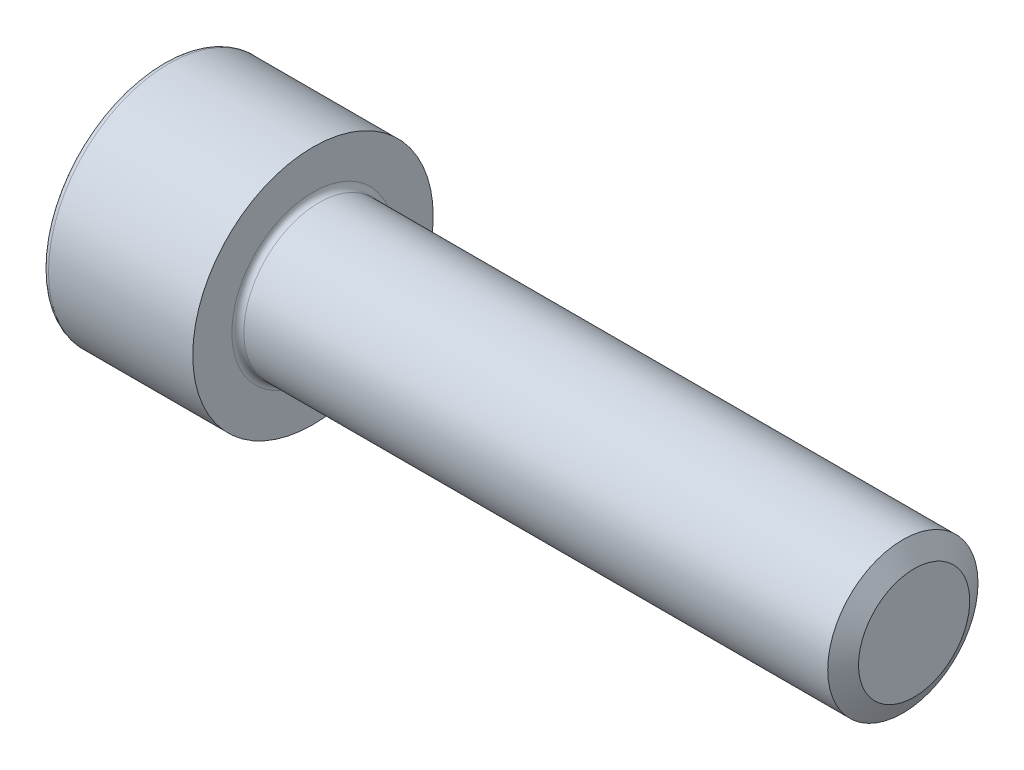
ISO-10303-21;
HEADER;
FILE_DESCRIPTION(('STEP AP214'),'2;1');
FILE_NAME('part.step','',(''),(''),'','','');
FILE_SCHEMA(('AUTOMOTIVE_DESIGN { 1 0 10303 214 1 1 1 1 }'));
ENDSEC;
DATA;
#1=APPLICATION_CONTEXT('core data for automotive mechanical design processes');
#2=APPLICATION_PROTOCOL_DEFINITION('international standard','automotive_design',2000,#1);
#3=PRODUCT_CONTEXT('',#1,'mechanical');
#4=PRODUCT('Part','Part','',(#3));
#5=PRODUCT_RELATED_PRODUCT_CATEGORY('part','',(#4));
#6=PRODUCT_DEFINITION_FORMATION('','',#4);
#7=PRODUCT_DEFINITION_CONTEXT('part definition',#1,'design');
#8=PRODUCT_DEFINITION('design','',#6,#7);
#9=PRODUCT_DEFINITION_SHAPE('','',#8);
#10=(LENGTH_UNIT() NAMED_UNIT(*) SI_UNIT(.MILLI.,.METRE.));
#11=(NAMED_UNIT(*) PLANE_ANGLE_UNIT() SI_UNIT($,.RADIAN.));
#12=(NAMED_UNIT(*) SI_UNIT($,.STERADIAN.) SOLID_ANGLE_UNIT());
#13=UNCERTAINTY_MEASURE_WITH_UNIT(LENGTH_MEASURE(1.E-05),#10,'distance_accuracy_value','');
#14=(GEOMETRIC_REPRESENTATION_CONTEXT(3) GLOBAL_UNCERTAINTY_ASSIGNED_CONTEXT((#13)) GLOBAL_UNIT_ASSIGNED_CONTEXT((#10,
#11,#12)) REPRESENTATION_CONTEXT('',''));
#15=CARTESIAN_POINT('',(0.,0.,0.));
#16=DIRECTION('',(0.,0.,1.));
#17=DIRECTION('',(1.,0.,0.));
#18=AXIS2_PLACEMENT_3D('',#15,#16,#17);
#19=CARTESIAN_POINT('',(0.,0.,0.));
#20=DIRECTION('',(1.,0.,0.));
#21=DIRECTION('',(0.,0.,-1.));
#22=AXIS2_PLACEMENT_3D('',#19,#20,#21);
#23=CYLINDRICAL_SURFACE('',#22,5.);
#24=CARTESIAN_POINT('',(10.4,0.,0.));
#25=DIRECTION('',(1.,0.,0.));
#26=DIRECTION('',(0.,0.,-1.));
#27=AXIS2_PLACEMENT_3D('',#24,#25,#26);
#28=CIRCLE('',#27,5.);
#29=CARTESIAN_POINT('',(10.4,0.,-5.));
#30=VERTEX_POINT('',#29);
#31=EDGE_CURVE('E120',#30,#30,#28,.T.);
#32=ORIENTED_EDGE('',*,*,#31,.T.);
#33=EDGE_LOOP('',(#32));
#34=FACE_BOUND('',#33,.T.);
#35=CARTESIAN_POINT('',(49.25,0.,0.));
#36=DIRECTION('',(-1.,0.,0.));
#37=DIRECTION('',(0.,0.,1.));
#38=AXIS2_PLACEMENT_3D('',#35,#36,#37);
#39=CIRCLE('',#38,5.);
#40=CARTESIAN_POINT('',(49.25,0.,5.));
#41=VERTEX_POINT('',#40);
#42=EDGE_CURVE('E309',#41,#41,#39,.T.);
#43=ORIENTED_EDGE('',*,*,#42,.T.);
#44=EDGE_LOOP('',(#43));
#45=FACE_BOUND('',#44,.T.);
#46=ADVANCED_FACE('F17',(#34,#45),#23,.T.);
#47=CARTESIAN_POINT('',(0.,0.,0.));
#48=DIRECTION('',(-1.,0.,0.));
#49=DIRECTION('',(0.,0.,1.));
#50=AXIS2_PLACEMENT_3D('',#47,#48,#49);
#51=PLANE('',#50);
#52=CARTESIAN_POINT('',(0.,0.,0.));
#53=DIRECTION('',(-1.,0.,0.));
#54=DIRECTION('',(0.,0.,1.));
#55=AXIS2_PLACEMENT_3D('',#52,#53,#54);
#56=CIRCLE('',#55,7.6);
#57=CARTESIAN_POINT('',(0.,0.,7.6));
#58=VERTEX_POINT('',#57);
#59=EDGE_CURVE('E11',#58,#58,#56,.T.);
#60=ORIENTED_EDGE('',*,*,#59,.T.);
#61=EDGE_LOOP('',(#60));
#62=FACE_BOUND('',#61,.T.);
#63=DIRECTION('',(0.,0.5,0.866025403784439));
#64=VECTOR('',#63,1.);
#65=CARTESIAN_POINT('',(0.,-4.575,0.));
#66=LINE('',#65,#64);
#67=CARTESIAN_POINT('',(0.,-4.575,0.));
#68=VERTEX_POINT('',#67);
#69=CARTESIAN_POINT('',(0.,-2.2875,3.96206622231381));
#70=VERTEX_POINT('',#69);
#71=EDGE_CURVE('E32',#68,#70,#66,.T.);
#72=ORIENTED_EDGE('',*,*,#71,.F.);
#73=DIRECTION('',(0.,-0.5,0.866025403784439));
#74=VECTOR('',#73,1.);
#75=CARTESIAN_POINT('',(0.,-2.2875,-3.96206622231381));
#76=LINE('',#75,#74);
#77=CARTESIAN_POINT('',(0.,-2.2875,-3.96206622231381));
#78=VERTEX_POINT('',#77);
#79=EDGE_CURVE('E116',#78,#68,#76,.T.);
#80=ORIENTED_EDGE('',*,*,#79,.F.);
#81=DIRECTION('',(0.,-1.,0.));
#82=VECTOR('',#81,1.);
#83=CARTESIAN_POINT('',(0.,2.2875,-3.96206622231381));
#84=LINE('',#83,#82);
#85=CARTESIAN_POINT('',(0.,2.2875,-3.96206622231381));
#86=VERTEX_POINT('',#85);
#87=EDGE_CURVE('E114',#86,#78,#84,.T.);
#88=ORIENTED_EDGE('',*,*,#87,.F.);
#89=DIRECTION('',(0.,-0.5,-0.866025403784439));
#90=VECTOR('',#89,1.);
#91=CARTESIAN_POINT('',(0.,4.575,0.));
#92=LINE('',#91,#90);
#93=CARTESIAN_POINT('',(0.,4.575,0.));
#94=VERTEX_POINT('',#93);
#95=EDGE_CURVE('E80',#94,#86,#92,.T.);
#96=ORIENTED_EDGE('',*,*,#95,.F.);
#97=DIRECTION('',(0.,0.5,-0.866025403784439));
#98=VECTOR('',#97,1.);
#99=CARTESIAN_POINT('',(0.,2.2875,3.96206622231381));
#100=LINE('',#99,#98);
#101=CARTESIAN_POINT('',(0.,2.2875,3.96206622231381));
#102=VERTEX_POINT('',#101);
#103=EDGE_CURVE('E110',#102,#94,#100,.T.);
#104=ORIENTED_EDGE('',*,*,#103,.F.);
#105=DIRECTION('',(0.,1.,0.));
#106=VECTOR('',#105,1.);
#107=CARTESIAN_POINT('',(0.,-2.2875,3.96206622231381));
#108=LINE('',#107,#106);
#109=EDGE_CURVE('E106',#70,#102,#108,.T.);
#110=ORIENTED_EDGE('',*,*,#109,.F.);
#111=EDGE_LOOP('',(#72,#80,#88,#96,#104,#110));
#112=FACE_BOUND('',#111,.T.);
#113=ADVANCED_FACE('F156',(#62,#112),#51,.T.);
#114=CARTESIAN_POINT('',(0.,0.,0.));
#115=DIRECTION('',(1.,0.,0.));
#116=DIRECTION('',(0.,0.,-1.));
#117=AXIS2_PLACEMENT_3D('',#114,#115,#116);
#118=CYLINDRICAL_SURFACE('',#117,8.);
#119=CARTESIAN_POINT('',(0.4,0.,0.));
#120=DIRECTION('',(-1.,0.,0.));
#121=DIRECTION('',(0.,0.,1.));
#122=AXIS2_PLACEMENT_3D('',#119,#120,#121);
#123=CIRCLE('',#122,8.);
#124=CARTESIAN_POINT('',(0.4,0.,8.));
#125=VERTEX_POINT('',#124);
#126=EDGE_CURVE('E25',#125,#125,#123,.F.);
#127=ORIENTED_EDGE('',*,*,#126,.T.);
#128=EDGE_LOOP('',(#127));
#129=FACE_BOUND('',#128,.T.);
#130=CARTESIAN_POINT('',(10.,0.,0.));
#131=DIRECTION('',(1.,0.,0.));
#132=DIRECTION('',(0.,0.,-1.));
#133=AXIS2_PLACEMENT_3D('',#130,#131,#132);
#134=CIRCLE('',#133,8.);
#135=CARTESIAN_POINT('',(10.,0.,-8.));
#136=VERTEX_POINT('',#135);
#137=EDGE_CURVE('E131',#136,#136,#134,.T.);
#138=ORIENTED_EDGE('',*,*,#137,.F.);
#139=EDGE_LOOP('',(#138));
#140=FACE_BOUND('',#139,.T.);
#141=ADVANCED_FACE('F137',(#129,#140),#118,.T.);
#142=CARTESIAN_POINT('',(10.,8.,0.));
#143=DIRECTION('',(1.,0.,0.));
#144=DIRECTION('',(0.,0.,-1.));
#145=AXIS2_PLACEMENT_3D('',#142,#143,#144);
#146=PLANE('',#145);
#147=ORIENTED_EDGE('',*,*,#137,.T.);
#148=EDGE_LOOP('',(#147));
#149=FACE_BOUND('',#148,.T.);
#150=CARTESIAN_POINT('',(10.,0.,0.));
#151=DIRECTION('',(1.,0.,0.));
#152=DIRECTION('',(0.,0.,-1.));
#153=AXIS2_PLACEMENT_3D('',#150,#151,#152);
#154=CIRCLE('',#153,5.4);
#155=CARTESIAN_POINT('',(10.,0.,-5.4));
#156=VERTEX_POINT('',#155);
#157=EDGE_CURVE('E128',#156,#156,#154,.T.);
#158=ORIENTED_EDGE('',*,*,#157,.F.);
#159=EDGE_LOOP('',(#158));
#160=FACE_BOUND('',#159,.T.);
#161=ADVANCED_FACE('F173',(#149,#160),#146,.T.);
#162=CARTESIAN_POINT('',(10.4,0.,0.));
#163=DIRECTION('',(1.,0.,0.));
#164=DIRECTION('',(0.,0.,-1.));
#165=AXIS2_PLACEMENT_3D('',#162,#163,#164);
#166=TOROIDAL_SURFACE('',#165,5.4,0.4);
#167=ORIENTED_EDGE('',*,*,#157,.T.);
#168=EDGE_LOOP('',(#167));
#169=FACE_BOUND('',#168,.T.);
#170=ORIENTED_EDGE('',*,*,#31,.F.);
#171=EDGE_LOOP('',(#170));
#172=FACE_BOUND('',#171,.T.);
#173=ADVANCED_FACE('F169',(#169,#172),#166,.F.);
#174=CARTESIAN_POINT('',(5.,-4.575,0.));
#175=DIRECTION('',(0.,-0.866025403784439,0.5));
#176=DIRECTION('',(0.,-0.5,-0.866025403784439));
#177=AXIS2_PLACEMENT_3D('',#174,#175,#176);
#178=PLANE('',#177);
#179=ORIENTED_EDGE('',*,*,#71,.T.);
#180=DIRECTION('',(-1.,0.,0.));
#181=VECTOR('',#180,1.);
#182=CARTESIAN_POINT('',(5.,-2.2875,3.96206622231381));
#183=LINE('',#182,#181);
#184=CARTESIAN_POINT('',(5.,-2.2875,3.96206622231381));
#185=VERTEX_POINT('',#184);
#186=EDGE_CURVE('E62',#185,#70,#183,.T.);
#187=ORIENTED_EDGE('',*,*,#186,.F.);
#188=DIRECTION('',(0.,0.5,0.866025403784439));
#189=VECTOR('',#188,1.);
#190=CARTESIAN_POINT('',(5.,-4.575,0.));
#191=LINE('',#190,#189);
#192=CARTESIAN_POINT('',(5.,-4.575,0.));
#193=VERTEX_POINT('',#192);
#194=EDGE_CURVE('E118',#193,#185,#191,.T.);
#195=ORIENTED_EDGE('',*,*,#194,.F.);
#196=DIRECTION('',(-1.,0.,0.));
#197=VECTOR('',#196,1.);
#198=CARTESIAN_POINT('',(5.,-4.575,0.));
#199=LINE('',#198,#197);
#200=EDGE_CURVE('E40',#193,#68,#199,.T.);
#201=ORIENTED_EDGE('',*,*,#200,.T.);
#202=EDGE_LOOP('',(#179,#187,#195,#201));
#203=FACE_BOUND('',#202,.T.);
#204=ADVANCED_FACE('F172',(#203),#178,.F.);
#205=CARTESIAN_POINT('',(5.,-2.2875,-3.96206622231381));
#206=DIRECTION('',(0.,-0.866025403784439,-0.5));
#207=DIRECTION('',(0.,0.5,-0.866025403784439));
#208=AXIS2_PLACEMENT_3D('',#205,#206,#207);
#209=PLANE('',#208);
#210=ORIENTED_EDGE('',*,*,#79,.T.);
#211=ORIENTED_EDGE('',*,*,#200,.F.);
#212=DIRECTION('',(0.,-0.5,0.866025403784439));
#213=VECTOR('',#212,1.);
#214=CARTESIAN_POINT('',(5.,-2.2875,-3.96206622231381));
#215=LINE('',#214,#213);
#216=CARTESIAN_POINT('',(5.,-2.2875,-3.96206622231381));
#217=VERTEX_POINT('',#216);
#218=EDGE_CURVE('E92',#217,#193,#215,.T.);
#219=ORIENTED_EDGE('',*,*,#218,.F.);
#220=DIRECTION('',(-1.,0.,0.));
#221=VECTOR('',#220,1.);
#222=CARTESIAN_POINT('',(5.,-2.2875,-3.96206622231381));
#223=LINE('',#222,#221);
#224=EDGE_CURVE('E84',#217,#78,#223,.T.);
#225=ORIENTED_EDGE('',*,*,#224,.T.);
#226=EDGE_LOOP('',(#210,#211,#219,#225));
#227=FACE_BOUND('',#226,.T.);
#228=ADVANCED_FACE('F205',(#227),#209,.F.);
#229=CARTESIAN_POINT('',(5.,2.2875,-3.96206622231381));
#230=DIRECTION('',(0.,0.,-1.));
#231=DIRECTION('',(0.,1.,0.));
#232=AXIS2_PLACEMENT_3D('',#229,#230,#231);
#233=PLANE('',#232);
#234=ORIENTED_EDGE('',*,*,#87,.T.);
#235=ORIENTED_EDGE('',*,*,#224,.F.);
#236=DIRECTION('',(0.,-1.,0.));
#237=VECTOR('',#236,1.);
#238=CARTESIAN_POINT('',(5.,2.2875,-3.96206622231381));
#239=LINE('',#238,#237);
#240=CARTESIAN_POINT('',(5.,2.2875,-3.96206622231381));
#241=VERTEX_POINT('',#240);
#242=EDGE_CURVE('E88',#241,#217,#239,.T.);
#243=ORIENTED_EDGE('',*,*,#242,.F.);
#244=DIRECTION('',(-1.,0.,0.));
#245=VECTOR('',#244,1.);
#246=CARTESIAN_POINT('',(5.,2.2875,-3.96206622231381));
#247=LINE('',#246,#245);
#248=EDGE_CURVE('E73',#241,#86,#247,.T.);
#249=ORIENTED_EDGE('',*,*,#248,.T.);
#250=EDGE_LOOP('',(#234,#235,#243,#249));
#251=FACE_BOUND('',#250,.T.);
#252=ADVANCED_FACE('F89',(#251),#233,.F.);
#253=CARTESIAN_POINT('',(5.,4.575,0.));
#254=DIRECTION('',(0.,0.866025403784439,-0.5));
#255=DIRECTION('',(0.,0.5,0.866025403784439));
#256=AXIS2_PLACEMENT_3D('',#253,#254,#255);
#257=PLANE('',#256);
#258=ORIENTED_EDGE('',*,*,#95,.T.);
#259=ORIENTED_EDGE('',*,*,#248,.F.);
#260=DIRECTION('',(0.,-0.5,-0.866025403784439));
#261=VECTOR('',#260,1.);
#262=CARTESIAN_POINT('',(5.,4.575,0.));
#263=LINE('',#262,#261);
#264=CARTESIAN_POINT('',(5.,4.575,0.));
#265=VERTEX_POINT('',#264);
#266=EDGE_CURVE('E77',#265,#241,#263,.T.);
#267=ORIENTED_EDGE('',*,*,#266,.F.);
#268=DIRECTION('',(-1.,0.,0.));
#269=VECTOR('',#268,1.);
#270=CARTESIAN_POINT('',(5.,4.575,0.));
#271=LINE('',#270,#269);
#272=EDGE_CURVE('E85',#265,#94,#271,.T.);
#273=ORIENTED_EDGE('',*,*,#272,.T.);
#274=EDGE_LOOP('',(#258,#259,#267,#273));
#275=FACE_BOUND('',#274,.T.);
#276=ADVANCED_FACE('F75',(#275),#257,.F.);
#277=CARTESIAN_POINT('',(5.,2.2875,3.96206622231381));
#278=DIRECTION('',(0.,0.866025403784439,0.5));
#279=DIRECTION('',(0.,-0.5,0.866025403784439));
#280=AXIS2_PLACEMENT_3D('',#277,#278,#279);
#281=PLANE('',#280);
#282=ORIENTED_EDGE('',*,*,#103,.T.);
#283=ORIENTED_EDGE('',*,*,#272,.F.);
#284=DIRECTION('',(0.,0.5,-0.866025403784439));
#285=VECTOR('',#284,1.);
#286=CARTESIAN_POINT('',(5.,2.2875,3.96206622231381));
#287=LINE('',#286,#285);
#288=CARTESIAN_POINT('',(5.,2.2875,3.96206622231381));
#289=VERTEX_POINT('',#288);
#290=EDGE_CURVE('E98',#289,#265,#287,.T.);
#291=ORIENTED_EDGE('',*,*,#290,.F.);
#292=DIRECTION('',(-1.,0.,0.));
#293=VECTOR('',#292,1.);
#294=CARTESIAN_POINT('',(5.,2.2875,3.96206622231381));
#295=LINE('',#294,#293);
#296=EDGE_CURVE('E123',#289,#102,#295,.T.);
#297=ORIENTED_EDGE('',*,*,#296,.T.);
#298=EDGE_LOOP('',(#282,#283,#291,#297));
#299=FACE_BOUND('',#298,.T.);
#300=ADVANCED_FACE('F226',(#299),#281,.F.);
#301=CARTESIAN_POINT('',(5.,-2.2875,3.96206622231381));
#302=DIRECTION('',(0.,0.,1.));
#303=DIRECTION('',(0.,-1.,0.));
#304=AXIS2_PLACEMENT_3D('',#301,#302,#303);
#305=PLANE('',#304);
#306=ORIENTED_EDGE('',*,*,#109,.T.);
#307=ORIENTED_EDGE('',*,*,#296,.F.);
#308=DIRECTION('',(0.,1.,0.));
#309=VECTOR('',#308,1.);
#310=CARTESIAN_POINT('',(5.,-2.2875,3.96206622231381));
#311=LINE('',#310,#309);
#312=EDGE_CURVE('E100',#185,#289,#311,.T.);
#313=ORIENTED_EDGE('',*,*,#312,.F.);
#314=ORIENTED_EDGE('',*,*,#186,.T.);
#315=EDGE_LOOP('',(#306,#307,#313,#314));
#316=FACE_BOUND('',#315,.T.);
#317=ADVANCED_FACE('F152',(#316),#305,.F.);
#318=CARTESIAN_POINT('',(5.,-2.2875,3.96206622231381));
#319=DIRECTION('',(-1.,0.,0.));
#320=DIRECTION('',(0.,0.,1.));
#321=AXIS2_PLACEMENT_3D('',#318,#319,#320);
#322=PLANE('',#321);
#323=ORIENTED_EDGE('',*,*,#194,.T.);
#324=ORIENTED_EDGE('',*,*,#312,.T.);
#325=ORIENTED_EDGE('',*,*,#290,.T.);
#326=ORIENTED_EDGE('',*,*,#266,.T.);
#327=ORIENTED_EDGE('',*,*,#242,.T.);
#328=ORIENTED_EDGE('',*,*,#218,.T.);
#329=EDGE_LOOP('',(#323,#324,#325,#326,#327,#328));
#330=FACE_BOUND('',#329,.T.);
#331=ADVANCED_FACE('F95',(#330),#322,.T.);
#332=CARTESIAN_POINT('',(0.4,0.,0.));
#333=DIRECTION('',(-1.,0.,0.));
#334=DIRECTION('',(0.,0.,1.));
#335=AXIS2_PLACEMENT_3D('',#332,#333,#334);
#336=TOROIDAL_SURFACE('',#335,7.6,0.4);
#337=ORIENTED_EDGE('',*,*,#59,.F.);
#338=EDGE_LOOP('',(#337));
#339=FACE_BOUND('',#338,.T.);
#340=ORIENTED_EDGE('',*,*,#126,.F.);
#341=EDGE_LOOP('',(#340));
#342=FACE_BOUND('',#341,.T.);
#343=ADVANCED_FACE('F19',(#339,#342),#336,.T.);
#344=CARTESIAN_POINT('',(49.25,0.,0.));
#345=DIRECTION('',(-1.,0.,0.));
#346=DIRECTION('',(0.,0.,1.));
#347=AXIS2_PLACEMENT_3D('',#344,#345,#346);
#348=CONICAL_SURFACE('',#347,5.,1.04718484902493);
#349=CARTESIAN_POINT('',(50.,0.,0.));
#350=DIRECTION('',(-1.,0.,0.));
#351=DIRECTION('',(0.,0.,1.));
#352=AXIS2_PLACEMENT_3D('',#349,#350,#351);
#353=CIRCLE('',#352,3.701);
#354=CARTESIAN_POINT('',(50.,0.,3.701));
#355=VERTEX_POINT('',#354);
#356=EDGE_CURVE('E107',#355,#355,#353,.T.);
#357=ORIENTED_EDGE('',*,*,#356,.T.);
#358=EDGE_LOOP('',(#357));
#359=FACE_BOUND('',#358,.T.);
#360=ORIENTED_EDGE('',*,*,#42,.F.);
#361=EDGE_LOOP('',(#360));
#362=FACE_BOUND('',#361,.T.);
#363=ADVANCED_FACE('F141',(#359,#362),#348,.T.);
#364=CARTESIAN_POINT('',(50.,5.,0.));
#365=DIRECTION('',(1.,0.,0.));
#366=DIRECTION('',(0.,0.,-1.));
#367=AXIS2_PLACEMENT_3D('',#364,#365,#366);
#368=PLANE('',#367);
#369=ORIENTED_EDGE('',*,*,#356,.F.);
#370=EDGE_LOOP('',(#369));
#371=FACE_BOUND('',#370,.T.);
#372=ADVANCED_FACE('F149',(#371),#368,.T.);
#373=CLOSED_SHELL('',(#46,#113,#141,#161,#173,#204,#228,#252,#276,#300,#317,#331,#343,#363,#372));
#374=MANIFOLD_SOLID_BREP('B1',#373);
#375=ADVANCED_BREP_SHAPE_REPRESENTATION('',(#18,#374),#14);
#376=SHAPE_DEFINITION_REPRESENTATION(#9,#375);
ENDSEC;
END-ISO-10303-21;
